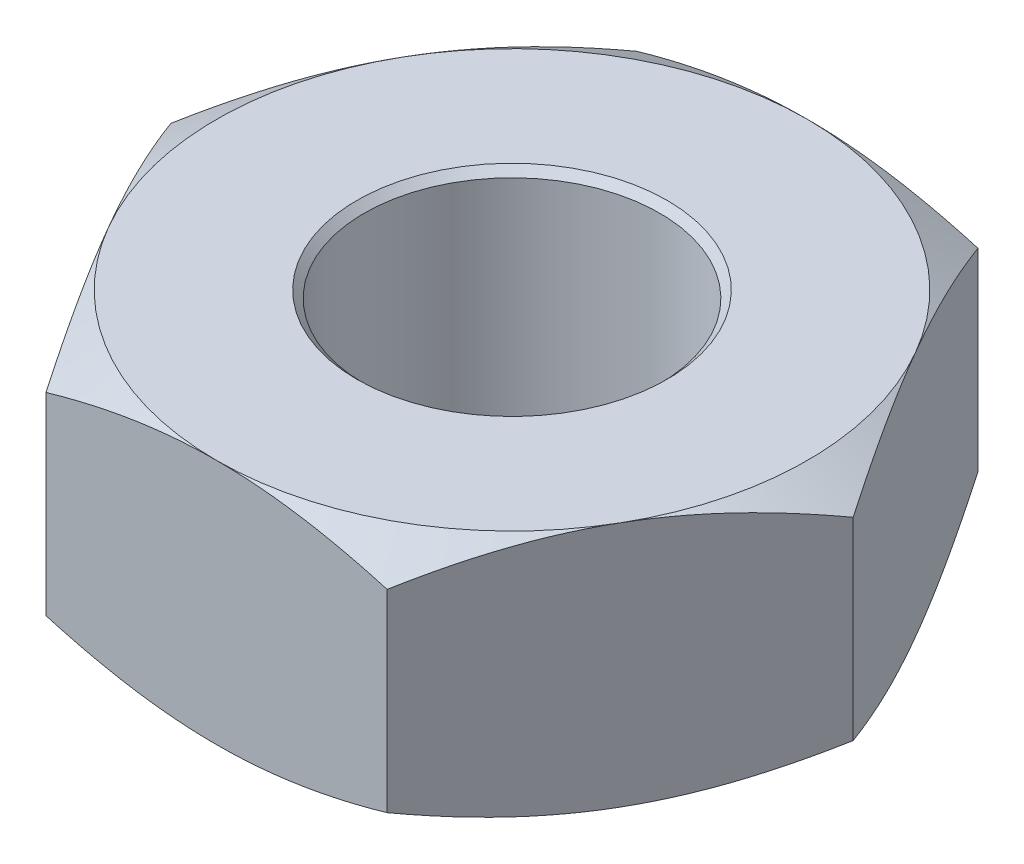
ISO-10303-21;
HEADER;
FILE_DESCRIPTION(('STEP AP214'),'2;1');
FILE_NAME('part.step','',(''),(''),'','','');
FILE_SCHEMA(('AUTOMOTIVE_DESIGN { 1 0 10303 214 1 1 1 1 }'));
ENDSEC;
DATA;
#1=APPLICATION_CONTEXT('core data for automotive mechanical design processes');
#2=APPLICATION_PROTOCOL_DEFINITION('international standard','automotive_design',2000,#1);
#3=PRODUCT_CONTEXT('',#1,'mechanical');
#4=PRODUCT('Part','Part','',(#3));
#5=PRODUCT_RELATED_PRODUCT_CATEGORY('part','',(#4));
#6=PRODUCT_DEFINITION_FORMATION('','',#4);
#7=PRODUCT_DEFINITION_CONTEXT('part definition',#1,'design');
#8=PRODUCT_DEFINITION('design','',#6,#7);
#9=PRODUCT_DEFINITION_SHAPE('','',#8);
#10=(LENGTH_UNIT() NAMED_UNIT(*) SI_UNIT(.MILLI.,.METRE.));
#11=(NAMED_UNIT(*) PLANE_ANGLE_UNIT() SI_UNIT($,.RADIAN.));
#12=(NAMED_UNIT(*) SI_UNIT($,.STERADIAN.) SOLID_ANGLE_UNIT());
#13=UNCERTAINTY_MEASURE_WITH_UNIT(LENGTH_MEASURE(1.E-05),#10,'distance_accuracy_value','');
#14=(GEOMETRIC_REPRESENTATION_CONTEXT(3) GLOBAL_UNCERTAINTY_ASSIGNED_CONTEXT((#13)) GLOBAL_UNIT_ASSIGNED_CONTEXT((#10,
#11,#12)) REPRESENTATION_CONTEXT('',''));
#15=CARTESIAN_POINT('',(0.,0.,0.));
#16=DIRECTION('',(0.,0.,1.));
#17=DIRECTION('',(1.,0.,0.));
#18=AXIS2_PLACEMENT_3D('',#15,#16,#17);
#19=CARTESIAN_POINT('',(0.,2.5,0.));
#20=DIRECTION('',(0.,1.,0.));
#21=DIRECTION('',(0.,0.,1.));
#22=AXIS2_PLACEMENT_3D('',#19,#20,#21);
#23=PLANE('',#22);
#24=CARTESIAN_POINT('',(0.,2.5,0.));
#25=DIRECTION('',(0.,1.,0.));
#26=DIRECTION('',(0.,0.,1.));
#27=AXIS2_PLACEMENT_3D('',#24,#25,#26);
#28=CIRCLE('',#27,1.575);
#29=CARTESIAN_POINT('',(0.,2.5,1.575));
#30=VERTEX_POINT('',#29);
#31=EDGE_CURVE('E12',#30,#30,#28,.F.);
#32=ORIENTED_EDGE('',*,*,#31,.T.);
#33=EDGE_LOOP('',(#32));
#34=FACE_BOUND('',#33,.T.);
#35=CARTESIAN_POINT('',(0.,2.5,0.));
#36=DIRECTION('',(0.,1.,0.));
#37=DIRECTION('',(0.,0.,1.));
#38=AXIS2_PLACEMENT_3D('',#35,#36,#37);
#39=CIRCLE('',#38,3.);
#40=CARTESIAN_POINT('',(-2.59807621135332,2.5,1.5));
#41=VERTEX_POINT('',#40);
#42=CARTESIAN_POINT('',(0.,2.5,3.));
#43=VERTEX_POINT('',#42);
#44=EDGE_CURVE('E158',#41,#43,#39,.T.);
#45=ORIENTED_EDGE('',*,*,#44,.T.);
#46=CARTESIAN_POINT('',(2.59807621135332,2.5,1.5));
#47=VERTEX_POINT('',#46);
#48=EDGE_CURVE('E139',#43,#47,#39,.T.);
#49=ORIENTED_EDGE('',*,*,#48,.T.);
#50=CARTESIAN_POINT('',(2.59807621135332,2.5,-1.5));
#51=VERTEX_POINT('',#50);
#52=EDGE_CURVE('E129',#47,#51,#39,.T.);
#53=ORIENTED_EDGE('',*,*,#52,.T.);
#54=CARTESIAN_POINT('',(0.,2.5,-3.));
#55=VERTEX_POINT('',#54);
#56=EDGE_CURVE('E55',#51,#55,#39,.T.);
#57=ORIENTED_EDGE('',*,*,#56,.T.);
#58=CARTESIAN_POINT('',(-2.59807621135332,2.5,-1.5));
#59=VERTEX_POINT('',#58);
#60=EDGE_CURVE('E63',#55,#59,#39,.T.);
#61=ORIENTED_EDGE('',*,*,#60,.T.);
#62=EDGE_CURVE('E162',#59,#41,#39,.T.);
#63=ORIENTED_EDGE('',*,*,#62,.T.);
#64=EDGE_LOOP('',(#45,#49,#53,#57,#61,#63));
#65=FACE_BOUND('',#64,.T.);
#66=ADVANCED_FACE('F39',(#34,#65),#23,.T.);
#67=CARTESIAN_POINT('',(1.73205080756888,2.5,3.));
#68=DIRECTION('',(-0.866025403784439,0.,-0.5));
#69=DIRECTION('',(-0.5,0.,0.866025403784439));
#70=AXIS2_PLACEMENT_3D('',#67,#68,#69);
#71=PLANE('',#70);
#72=CARTESIAN_POINT('',(1.73193533751504,2.23198413756899,3.0002));
#73=CARTESIAN_POINT('',(1.80805042952748,2.27594629554769,2.86836479341167));
#74=CARTESIAN_POINT('',(1.88482254163057,2.31592841370737,2.73539159464475));
#75=CARTESIAN_POINT('',(2.03969618244675,2.38571791955453,2.46714257999794));
#76=CARTESIAN_POINT('',(2.11780046324563,2.41550061773462,2.33186199736566));
#77=CARTESIAN_POINT('',(2.27304105912604,2.46186216078874,2.06297739790352));
#78=CARTESIAN_POINT('',(2.35015348720802,2.47874955887705,1.92941475457054));
#79=CARTESIAN_POINT('',(2.50474122256553,2.49891035755148,1.66166094270431));
#80=CARTESIAN_POINT('',(2.58221596787771,2.50220045221892,1.52747074752016));
#81=CARTESIAN_POINT('',(2.72698443778646,2.49535946911461,1.27672440230419));
#82=CARTESIAN_POINT('',(2.79429982297457,2.48690808580738,1.16013073502732));
#83=CARTESIAN_POINT('',(2.92849202968483,2.46012105699297,0.927703015025364));
#84=CARTESIAN_POINT('',(2.99536838698943,2.44177625913829,0.811869766348669));
#85=CARTESIAN_POINT('',(3.12983731964848,2.39591524914667,0.578962742943633));
#86=CARTESIAN_POINT('',(3.19741287398332,2.36820461473692,0.46191844948606));
#87=CARTESIAN_POINT('',(3.33155605209904,2.3053122048626,0.229575649500876));
#88=CARTESIAN_POINT('',(3.39812539473502,2.27014520897845,0.114274165828894));
#89=CARTESIAN_POINT('',(3.46421708519159,2.23198413756899,-0.000199999999999475));
#90=B_SPLINE_CURVE_WITH_KNOTS('',3,(#72,#73,#74,#75,#76,#77,#78,#79,#80,#81,#82,#83,#84,#85,#86,
#87,#88,#89),.UNSPECIFIED.,.F.,.F.,(4,2,2,2,2,2,2,2,4),(0.,0.475539830103041,0.952222784107964,
1.41710776961288,1.88142182298026,2.28572436316091,2.69040156475039,3.10405572063576,
3.5168974940707),.UNSPECIFIED.);
#91=CARTESIAN_POINT('',(1.73205080756888,2.23205080756888,3.));
#92=VERTEX_POINT('',#91);
#93=EDGE_CURVE('E144',#92,#47,#90,.T.);
#94=ORIENTED_EDGE('',*,*,#93,.F.);
#95=DIRECTION('',(0.,-1.,0.));
#96=VECTOR('',#95,1.);
#97=CARTESIAN_POINT('',(1.73205080756888,2.5,3.));
#98=LINE('',#97,#96);
#99=CARTESIAN_POINT('',(1.73205080756888,0.267949192431121,3.));
#100=VERTEX_POINT('',#99);
#101=EDGE_CURVE('E355',#92,#100,#98,.T.);
#102=ORIENTED_EDGE('',*,*,#101,.T.);
#103=CARTESIAN_POINT('',(1.73193533751504,0.26801586243101,3.0002));
#104=CARTESIAN_POINT('',(1.80805042952748,0.224053704452306,2.86836479341167));
#105=CARTESIAN_POINT('',(1.88482254163057,0.184071586292628,2.73539159464475));
#106=CARTESIAN_POINT('',(2.03969618244675,0.114282080445466,2.46714257999794));
#107=CARTESIAN_POINT('',(2.11780046324563,0.0844993822653805,2.33186199736566));
#108=CARTESIAN_POINT('',(2.27304105912604,0.0381378392112548,2.06297739790352));
#109=CARTESIAN_POINT('',(2.35015348720802,0.0212504411229496,1.92941475457054));
#110=CARTESIAN_POINT('',(2.50474122256553,0.00108964244852395,1.66166094270431));
#111=CARTESIAN_POINT('',(2.58221596787771,-0.00220045221891933,1.52747074752016));
#112=CARTESIAN_POINT('',(2.72698443778646,0.00464053088539041,1.27672440230419));
#113=CARTESIAN_POINT('',(2.79429982297457,0.0130919141926162,1.16013073502733));
#114=CARTESIAN_POINT('',(2.92849202968483,0.0398789430070345,0.927703015025365));
#115=CARTESIAN_POINT('',(2.99536838698943,0.0582237408617116,0.81186976634867));
#116=CARTESIAN_POINT('',(3.12983731964848,0.104084750853326,0.578962742943633));
#117=CARTESIAN_POINT('',(3.19741287398332,0.131795385263082,0.46191844948606));
#118=CARTESIAN_POINT('',(3.33155605209904,0.1946877951374,0.229575649500876));
#119=CARTESIAN_POINT('',(3.39812539473502,0.229854791021555,0.114274165828894));
#120=CARTESIAN_POINT('',(3.46421708519159,0.268015862431009,-0.000199999999999489));
#121=B_SPLINE_CURVE_WITH_KNOTS('',3,(#103,#104,#105,#106,#107,#108,#109,#110,#111,#112,#113,
#114,#115,#116,#117,#118,#119,#120),.UNSPECIFIED.,.F.,.F.,(4,2,2,2,2,2,2,2,4),(0.,
0.475539830103041,0.952222784107964,1.41710776961288,1.88142182298026,2.28572436316091,
2.69040156475039,3.10405572063576,3.5168974940707),.UNSPECIFIED.);
#122=CARTESIAN_POINT('',(2.59807621135332,0.,1.5));
#123=VERTEX_POINT('',#122);
#124=EDGE_CURVE('E329',#100,#123,#121,.T.);
#125=ORIENTED_EDGE('',*,*,#124,.T.);
#126=CARTESIAN_POINT('',(3.46410161513775,0.26794919243112,0.));
#127=VERTEX_POINT('',#126);
#128=EDGE_CURVE('E354',#123,#127,#121,.T.);
#129=ORIENTED_EDGE('',*,*,#128,.T.);
#130=DIRECTION('',(0.,-1.,0.));
#131=VECTOR('',#130,1.);
#132=CARTESIAN_POINT('',(3.46410161513775,2.5,0.));
#133=LINE('',#132,#131);
#134=CARTESIAN_POINT('',(3.46410161513775,2.23205080756888,0.));
#135=VERTEX_POINT('',#134);
#136=EDGE_CURVE('E155',#135,#127,#133,.T.);
#137=ORIENTED_EDGE('',*,*,#136,.F.);
#138=EDGE_CURVE('E133',#47,#135,#90,.T.);
#139=ORIENTED_EDGE('',*,*,#138,.F.);
#140=EDGE_LOOP('',(#94,#102,#125,#129,#137,#139));
#141=FACE_BOUND('',#140,.T.);
#142=ADVANCED_FACE('F153',(#141),#71,.F.);
#143=CARTESIAN_POINT('',(3.46410161513775,2.5,0.));
#144=DIRECTION('',(-0.866025403784439,0.,0.5));
#145=DIRECTION('',(0.5,0.,0.866025403784439));
#146=AXIS2_PLACEMENT_3D('',#143,#144,#145);
#147=PLANE('',#146);
#148=CARTESIAN_POINT('',(3.46421708519159,2.23198413756899,0.000200000000000041));
#149=CARTESIAN_POINT('',(3.38810199317915,2.2759462955477,-0.131635206588332));
#150=CARTESIAN_POINT('',(3.31132988107606,2.31592841370737,-0.264608405355249));
#151=CARTESIAN_POINT('',(3.15645624025988,2.38571791955454,-0.532857420002055));
#152=CARTESIAN_POINT('',(3.078351959461,2.41550061773462,-0.668138002634341));
#153=CARTESIAN_POINT('',(2.92311136358059,2.46186216078875,-0.937022602096482));
#154=CARTESIAN_POINT('',(2.84599893549861,2.47874955887705,-1.07058524542946));
#155=CARTESIAN_POINT('',(2.6914112001411,2.49891035755148,-1.33833905729569));
#156=CARTESIAN_POINT('',(2.61393645482892,2.50220045221892,-1.47252925247984));
#157=CARTESIAN_POINT('',(2.46916798492017,2.49535946911461,-1.72327559769581));
#158=CARTESIAN_POINT('',(2.40185259973206,2.48690808580738,-1.83986926497268));
#159=CARTESIAN_POINT('',(2.2676603930218,2.46012105699297,-2.07229698497464));
#160=CARTESIAN_POINT('',(2.2007840357172,2.44177625913829,-2.18813023365133));
#161=CARTESIAN_POINT('',(2.06631510305815,2.39591524914667,-2.42103725705637));
#162=CARTESIAN_POINT('',(1.99873954872331,2.36820461473692,-2.53808155051394));
#163=CARTESIAN_POINT('',(1.86459637060759,2.3053122048626,-2.77042435049913));
#164=CARTESIAN_POINT('',(1.79802702797161,2.27014520897844,-2.88572583417111));
#165=CARTESIAN_POINT('',(1.73193533751504,2.23198413756899,-3.0002));
#166=B_SPLINE_CURVE_WITH_KNOTS('',3,(#148,#149,#150,#151,#152,#153,#154,#155,#156,#157,#158,
#159,#160,#161,#162,#163,#164,#165),.UNSPECIFIED.,.F.,.F.,(4,2,2,2,2,2,2,2,4),(0.,
0.47553983010304,0.952222784107963,1.41710776961288,1.88142182298026,2.28572436316091,
2.69040156475039,3.10405572063577,3.51689749407071),.UNSPECIFIED.);
#167=EDGE_CURVE('E135',#135,#51,#166,.T.);
#168=ORIENTED_EDGE('',*,*,#167,.F.);
#169=ORIENTED_EDGE('',*,*,#136,.T.);
#170=CARTESIAN_POINT('',(3.46421708519159,0.268015862431009,0.000200000000000056));
#171=CARTESIAN_POINT('',(3.38810199317915,0.224053704452305,-0.131635206588332));
#172=CARTESIAN_POINT('',(3.31132988107606,0.184071586292627,-0.264608405355249));
#173=CARTESIAN_POINT('',(3.15645624025988,0.114282080445465,-0.532857420002056));
#174=CARTESIAN_POINT('',(3.078351959461,0.0844993822653796,-0.668138002634341));
#175=CARTESIAN_POINT('',(2.92311136358059,0.0381378392112539,-0.937022602096482));
#176=CARTESIAN_POINT('',(2.84599893549861,0.0212504411229489,-1.07058524542946));
#177=CARTESIAN_POINT('',(2.6914112001411,0.00108964244852329,-1.33833905729569));
#178=CARTESIAN_POINT('',(2.61393645482892,-0.00220045221892007,-1.47252925247984));
#179=CARTESIAN_POINT('',(2.46916798492017,0.00464053088538978,-1.72327559769581));
#180=CARTESIAN_POINT('',(2.40185259973206,0.0130919141926157,-1.83986926497268));
#181=CARTESIAN_POINT('',(2.2676603930218,0.0398789430070344,-2.07229698497464));
#182=CARTESIAN_POINT('',(2.2007840357172,0.0582237408617117,-2.18813023365133));
#183=CARTESIAN_POINT('',(2.06631510305815,0.104084750853327,-2.42103725705637));
#184=CARTESIAN_POINT('',(1.99873954872331,0.131795385263082,-2.53808155051394));
#185=CARTESIAN_POINT('',(1.86459637060759,0.1946877951374,-2.77042435049913));
#186=CARTESIAN_POINT('',(1.79802702797161,0.229854791021556,-2.88572583417111));
#187=CARTESIAN_POINT('',(1.73193533751504,0.26801586243101,-3.0002));
#188=B_SPLINE_CURVE_WITH_KNOTS('',3,(#170,#171,#172,#173,#174,#175,#176,#177,#178,#179,#180,
#181,#182,#183,#184,#185,#186,#187),.UNSPECIFIED.,.F.,.F.,(4,2,2,2,2,2,2,2,4),(0.,
0.47553983010304,0.952222784107963,1.41710776961288,1.88142182298026,2.28572436316091,
2.69040156475039,3.10405572063576,3.51689749407071),.UNSPECIFIED.);
#189=CARTESIAN_POINT('',(2.59807621135332,0.,-1.5));
#190=VERTEX_POINT('',#189);
#191=EDGE_CURVE('E353',#127,#190,#188,.T.);
#192=ORIENTED_EDGE('',*,*,#191,.T.);
#193=CARTESIAN_POINT('',(1.73205080756887,0.267949192431122,-3.));
#194=VERTEX_POINT('',#193);
#195=EDGE_CURVE('E276',#190,#194,#188,.T.);
#196=ORIENTED_EDGE('',*,*,#195,.T.);
#197=DIRECTION('',(0.,-1.,0.));
#198=VECTOR('',#197,1.);
#199=CARTESIAN_POINT('',(1.73205080756887,2.5,-3.));
#200=LINE('',#199,#198);
#201=CARTESIAN_POINT('',(1.73205080756887,2.23205080756888,-3.));
#202=VERTEX_POINT('',#201);
#203=EDGE_CURVE('E308',#202,#194,#200,.T.);
#204=ORIENTED_EDGE('',*,*,#203,.F.);
#205=EDGE_CURVE('E294',#51,#202,#166,.T.);
#206=ORIENTED_EDGE('',*,*,#205,.F.);
#207=EDGE_LOOP('',(#168,#169,#192,#196,#204,#206));
#208=FACE_BOUND('',#207,.T.);
#209=ADVANCED_FACE('F286',(#208),#147,.F.);
#210=CARTESIAN_POINT('',(1.73205080756887,2.5,-3.));
#211=DIRECTION('',(0.,0.,1.));
#212=DIRECTION('',(1.,0.,0.));
#213=AXIS2_PLACEMENT_3D('',#210,#211,#212);
#214=PLANE('',#213);
#215=CARTESIAN_POINT('',(6.00425268022764,0.356871231169848,-3.));
#216=CARTESIAN_POINT('',(5.86473041996145,0.428921014392276,-3.));
#217=CARTESIAN_POINT('',(5.72500964617243,0.500589644158594,-3.));
#218=CARTESIAN_POINT('',(5.44507981138725,0.64297240783296,-3.));
#219=CARTESIAN_POINT('',(5.30487074193428,0.713686525105297,-3.));
#220=CARTESIAN_POINT('',(5.02365472206823,0.854076972742319,-3.));
#221=CARTESIAN_POINT('',(4.88264685800049,0.923751476094195,-3.));
#222=CARTESIAN_POINT('',(4.59993610581518,1.0616831036808,-3.));
#223=CARTESIAN_POINT('',(4.45823320800549,1.12994020808031,-3.));
#224=CARTESIAN_POINT('',(4.16639642910305,1.26829469557517,-3.));
#225=CARTESIAN_POINT('',(4.01621664337084,1.33829551887321,-3.));
#226=CARTESIAN_POINT('',(3.71472292322728,1.47580826198024,-3.));
#227=CARTESIAN_POINT('',(3.5634090185299,1.54332024672455,-3.));
#228=CARTESIAN_POINT('',(3.25948309434437,1.67508926942966,-3.));
#229=CARTESIAN_POINT('',(3.10687201002012,1.73934845263113,-3.));
#230=CARTESIAN_POINT('',(2.79990592465827,1.86368244478916,-3.));
#231=CARTESIAN_POINT('',(2.64555053689181,1.92375630379266,-3.));
#232=CARTESIAN_POINT('',(2.3111489722189,2.04707140979012,-3.));
#233=CARTESIAN_POINT('',(2.13076354182027,2.10940649488542,-3.));
#234=CARTESIAN_POINT('',(1.76682724969568,2.22386735942118,-3.));
#235=CARTESIAN_POINT('',(1.58327800374382,2.27599819141495,-3.));
#236=CARTESIAN_POINT('',(1.21625487133985,2.36547916194676,-3.));
#237=CARTESIAN_POINT('',(1.03284880320385,2.40309678723645,-3.));
#238=CARTESIAN_POINT('',(0.755759319548079,2.44662341040051,-3.));
#239=CARTESIAN_POINT('',(0.663075580660516,2.45898171707807,-3.));
#240=CARTESIAN_POINT('',(0.477208637992913,2.47901496031915,-3.));
#241=CARTESIAN_POINT('',(0.384025513971579,2.48669062352622,-3.));
#242=CARTESIAN_POINT('',(0.196018963075258,2.49715957406304,-3.));
#243=CARTESIAN_POINT('',(0.101191437766766,2.49988000370613,-3.));
#244=CARTESIAN_POINT('',(-0.088469765868229,2.50011220972693,-3.));
#245=CARTESIAN_POINT('',(-0.183303444184143,2.49762399484234,-3.));
#246=CARTESIAN_POINT('',(-0.37271334215723,2.48753359170198,-3.));
#247=CARTESIAN_POINT('',(-0.467289512197438,2.47993047947404,-3.));
#248=CARTESIAN_POINT('',(-0.655934324788337,2.45989192879627,-3.));
#249=CARTESIAN_POINT('',(-0.750002881021765,2.4474556932161,-3.));
#250=CARTESIAN_POINT('',(-1.03496705665352,2.40290558606778,-3.));
#251=CARTESIAN_POINT('',(-1.22478167068484,2.3637802985462,-3.));
#252=CARTESIAN_POINT('',(-1.6008338919411,2.27130476763005,-3.));
#253=CARTESIAN_POINT('',(-1.7870702081686,2.21794948986926,-3.));
#254=CARTESIAN_POINT('',(-2.15252929913434,2.10206259482558,-3.));
#255=CARTESIAN_POINT('',(-2.33181787995182,2.03973505014779,-3.));
#256=CARTESIAN_POINT('',(-2.68774534775123,1.90787770041704,-3.));
#257=CARTESIAN_POINT('',(-2.86438351147797,1.83834596895604,-3.));
#258=CARTESIAN_POINT('',(-3.2157039562033,1.69397220819073,-3.));
#259=CARTESIAN_POINT('',(-3.39038366252905,1.61912396451583,-3.));
#260=CARTESIAN_POINT('',(-3.73800798148471,1.46557348822255,-3.));
#261=CARTESIAN_POINT('',(-3.91095278367861,1.38687168231319,-3.));
#262=CARTESIAN_POINT('',(-4.24543269058928,1.23124593501539,-3.));
#263=CARTESIAN_POINT('',(-4.40704457514254,1.15448633708797,-3.));
#264=CARTESIAN_POINT('',(-4.72930700142372,0.998965017562986,-3.));
#265=CARTESIAN_POINT('',(-4.88995750903086,0.920203225418956,-3.));
#266=CARTESIAN_POINT('',(-5.20991667104059,0.761385126458692,-3.));
#267=CARTESIAN_POINT('',(-5.36922805216593,0.681334300127657,-3.));
#268=CARTESIAN_POINT('',(-5.68719491577223,0.519974261265355,-3.));
#269=CARTESIAN_POINT('',(-5.84585045533065,0.438665161292307,-3.));
#270=CARTESIAN_POINT('',(-6.00425268022764,0.356871231169845,-3.));
#271=B_SPLINE_CURVE_WITH_KNOTS('',3,(#215,#216,#217,#218,#219,#220,#221,#222,#223,#224,#225,
#226,#227,#228,#229,#230,#231,#232,#233,#234,#235,#236,#237,#238,#239,#240,#241,#242,#243,#244,
#245,#246,#247,#248,#249,#250,#251,#252,#253,#254,#255,#256,#257,#258,#259,#260,#261,#262,#263,
#264,#265,#266,#267,#268,#269,#270),.UNSPECIFIED.,.F.,.F.,(4,2,2,2,2,2,2,2,2,2,2,2,2,2,2,2,2,2,
2,2,2,2,2,2,2,2,2,4),(0.,0.471084110202455,0.942176420115815,1.41401707997586,1.88586433837422,
2.38292480970965,2.87997230324004,3.37668760229776,3.87351527718165,4.44584951561338,
5.01789964653016,5.5788358047474,5.85924709756718,6.1396148656289,6.42407264590739,
6.70852994899798,6.9930386512107,7.27759429756611,7.85819315526503,8.43899769360837,
9.00822704514367,9.57760900405088,10.1476678169992,10.7176636488592,11.2543906793309,
11.7911366474365,12.3260084110505,12.8608326014377),.UNSPECIFIED.);
#272=EDGE_CURVE('E299',#202,#55,#271,.T.);
#273=ORIENTED_EDGE('',*,*,#272,.F.);
#274=ORIENTED_EDGE('',*,*,#203,.T.);
#275=CARTESIAN_POINT('',(6.00425268022764,2.14312876883015,-3.));
#276=CARTESIAN_POINT('',(5.86473041996145,2.07107898560772,-3.));
#277=CARTESIAN_POINT('',(5.72500964617243,1.99941035584141,-3.));
#278=CARTESIAN_POINT('',(5.44507981138725,1.85702759216704,-3.));
#279=CARTESIAN_POINT('',(5.30487074193428,1.7863134748947,-3.));
#280=CARTESIAN_POINT('',(5.02365472206823,1.64592302725768,-3.));
#281=CARTESIAN_POINT('',(4.88264685800049,1.57624852390581,-3.));
#282=CARTESIAN_POINT('',(4.59993610581518,1.4383168963192,-3.));
#283=CARTESIAN_POINT('',(4.45823320800549,1.37005979191969,-3.));
#284=CARTESIAN_POINT('',(4.16639642910305,1.23170530442483,-3.));
#285=CARTESIAN_POINT('',(4.01621664337084,1.16170448112679,-3.));
#286=CARTESIAN_POINT('',(3.71472292322728,1.02419173801976,-3.));
#287=CARTESIAN_POINT('',(3.5634090185299,0.956679753275449,-3.));
#288=CARTESIAN_POINT('',(3.25948309434437,0.824910730570338,-3.));
#289=CARTESIAN_POINT('',(3.10687201002012,0.760651547368871,-3.));
#290=CARTESIAN_POINT('',(2.79990592465827,0.636317555210841,-3.));
#291=CARTESIAN_POINT('',(2.64555053689181,0.576243696207336,-3.));
#292=CARTESIAN_POINT('',(2.3111489722189,0.452928590209882,-3.));
#293=CARTESIAN_POINT('',(2.13076354182027,0.390593505114583,-3.));
#294=CARTESIAN_POINT('',(1.76682724969569,0.276132640578825,-3.));
#295=CARTESIAN_POINT('',(1.58327800374382,0.224001808585046,-3.));
#296=CARTESIAN_POINT('',(1.21625487133986,0.134520838053239,-3.));
#297=CARTESIAN_POINT('',(1.03284880320385,0.0969032127635509,-3.));
#298=CARTESIAN_POINT('',(0.75575931954808,0.0533765895994892,-3.));
#299=CARTESIAN_POINT('',(0.663075580660518,0.0410182829219286,-3.));
#300=CARTESIAN_POINT('',(0.477208637992914,0.0209850396808547,-3.));
#301=CARTESIAN_POINT('',(0.38402551397158,0.0133093764737789,-3.));
#302=CARTESIAN_POINT('',(0.196018963075259,0.00284042593696308,-3.));
#303=CARTESIAN_POINT('',(0.101191437766767,0.000119996293873615,-3.));
#304=CARTESIAN_POINT('',(-0.0884697658682277,-0.000112209726933698,-3.));
#305=CARTESIAN_POINT('',(-0.183303444184142,0.00237600515765748,-3.));
#306=CARTESIAN_POINT('',(-0.372713342157229,0.0124664082980158,-3.));
#307=CARTESIAN_POINT('',(-0.467289512197438,0.0200695205259573,-3.));
#308=CARTESIAN_POINT('',(-0.655934324788338,0.0401080712037259,-3.));
#309=CARTESIAN_POINT('',(-0.750002881021765,0.0525443067838957,-3.));
#310=CARTESIAN_POINT('',(-1.03496705665352,0.0970944139322183,-3.));
#311=CARTESIAN_POINT('',(-1.22478167068484,0.136219701453802,-3.));
#312=CARTESIAN_POINT('',(-1.6008338919411,0.228695232369948,-3.));
#313=CARTESIAN_POINT('',(-1.7870702081686,0.282050510130739,-3.));
#314=CARTESIAN_POINT('',(-2.15252929913435,0.397937405174417,-3.));
#315=CARTESIAN_POINT('',(-2.33181787995182,0.460264949852214,-3.));
#316=CARTESIAN_POINT('',(-2.68774534775123,0.592122299582961,-3.));
#317=CARTESIAN_POINT('',(-2.86438351147797,0.661654031043964,-3.));
#318=CARTESIAN_POINT('',(-3.2157039562033,0.806027791809266,-3.));
#319=CARTESIAN_POINT('',(-3.39038366252905,0.880876035484172,-3.));
#320=CARTESIAN_POINT('',(-3.73800798148471,1.03442651177745,-3.));
#321=CARTESIAN_POINT('',(-3.91095278367861,1.11312831768681,-3.));
#322=CARTESIAN_POINT('',(-4.24543269058928,1.26875406498461,-3.));
#323=CARTESIAN_POINT('',(-4.40704457514254,1.34551366291203,-3.));
#324=CARTESIAN_POINT('',(-4.72930700142372,1.50103498243701,-3.));
#325=CARTESIAN_POINT('',(-4.88995750903087,1.57979677458104,-3.));
#326=CARTESIAN_POINT('',(-5.20991667104059,1.73861487354131,-3.));
#327=CARTESIAN_POINT('',(-5.36922805216593,1.81866569987235,-3.));
#328=CARTESIAN_POINT('',(-5.68719491577224,1.98002573873465,-3.));
#329=CARTESIAN_POINT('',(-5.84585045533065,2.06133483870769,-3.));
#330=CARTESIAN_POINT('',(-6.00425268022764,2.14312876883016,-3.));
#331=B_SPLINE_CURVE_WITH_KNOTS('',3,(#275,#276,#277,#278,#279,#280,#281,#282,#283,#284,#285,
#286,#287,#288,#289,#290,#291,#292,#293,#294,#295,#296,#297,#298,#299,#300,#301,#302,#303,#304,
#305,#306,#307,#308,#309,#310,#311,#312,#313,#314,#315,#316,#317,#318,#319,#320,#321,#322,#323,
#324,#325,#326,#327,#328,#329,#330),.UNSPECIFIED.,.F.,.F.,(4,2,2,2,2,2,2,2,2,2,2,2,2,2,2,2,2,2,
2,2,2,2,2,2,2,2,2,4),(0.,0.471084110202456,0.942176420115816,1.41401707997587,1.88586433837422,
2.38292480970964,2.87997230324004,3.37668760229776,3.87351527718165,4.44584951561338,
5.01789964653016,5.57883580474741,5.85924709756718,6.1396148656289,6.42407264590739,
6.70852994899798,6.9930386512107,7.27759429756611,7.85819315526503,8.43899769360838,
9.00822704514367,9.57760900405088,10.1476678169992,10.7176636488592,11.2543906793309,
11.7911366474365,12.3260084110505,12.8608326014377),.UNSPECIFIED.);
#332=CARTESIAN_POINT('',(0.,0.,-3.));
#333=VERTEX_POINT('',#332);
#334=EDGE_CURVE('E275',#194,#333,#331,.T.);
#335=ORIENTED_EDGE('',*,*,#334,.T.);
#336=CARTESIAN_POINT('',(-1.73205080756888,0.267949192431123,-3.));
#337=VERTEX_POINT('',#336);
#338=EDGE_CURVE('E268',#333,#337,#331,.T.);
#339=ORIENTED_EDGE('',*,*,#338,.T.);
#340=DIRECTION('',(0.,-1.,0.));
#341=VECTOR('',#340,1.);
#342=CARTESIAN_POINT('',(-1.73205080756888,2.5,-3.));
#343=LINE('',#342,#341);
#344=CARTESIAN_POINT('',(-1.73205080756888,2.23205080756888,-3.));
#345=VERTEX_POINT('',#344);
#346=EDGE_CURVE('E303',#345,#337,#343,.T.);
#347=ORIENTED_EDGE('',*,*,#346,.F.);
#348=EDGE_CURVE('E174',#55,#345,#271,.T.);
#349=ORIENTED_EDGE('',*,*,#348,.F.);
#350=EDGE_LOOP('',(#273,#274,#335,#339,#347,#349));
#351=FACE_BOUND('',#350,.T.);
#352=ADVANCED_FACE('F283',(#351),#214,.F.);
#353=CARTESIAN_POINT('',(-1.73205080756888,2.5,-3.));
#354=DIRECTION('',(0.866025403784439,0.,0.5));
#355=DIRECTION('',(0.5,0.,-0.866025403784439));
#356=AXIS2_PLACEMENT_3D('',#353,#354,#355);
#357=PLANE('',#356);
#358=CARTESIAN_POINT('',(-1.73193533751504,2.23198413756899,-3.0002));
#359=CARTESIAN_POINT('',(-1.80805042952748,2.27594629554769,-2.86836479341167));
#360=CARTESIAN_POINT('',(-1.88482254163057,2.31592841370737,-2.73539159464475));
#361=CARTESIAN_POINT('',(-2.03969618244675,2.38571791955453,-2.46714257999795));
#362=CARTESIAN_POINT('',(-2.11780046324563,2.41550061773462,-2.33186199736566));
#363=CARTESIAN_POINT('',(-2.27304105912605,2.46186216078874,-2.06297739790352));
#364=CARTESIAN_POINT('',(-2.35015348720802,2.47874955887705,-1.92941475457054));
#365=CARTESIAN_POINT('',(-2.50474122256554,2.49891035755147,-1.66166094270431));
#366=CARTESIAN_POINT('',(-2.58221596787771,2.50220045221892,-1.52747074752016));
#367=CARTESIAN_POINT('',(-2.72698443778647,2.49535946911461,-1.2767244023042));
#368=CARTESIAN_POINT('',(-2.79429982297457,2.48690808580738,-1.16013073502733));
#369=CARTESIAN_POINT('',(-2.92849202968483,2.46012105699296,-0.927703015025365));
#370=CARTESIAN_POINT('',(-2.99536838698943,2.44177625913829,-0.81186976634867));
#371=CARTESIAN_POINT('',(-3.12983731964849,2.39591524914667,-0.578962742943633));
#372=CARTESIAN_POINT('',(-3.19741287398333,2.36820461473692,-0.46191844948606));
#373=CARTESIAN_POINT('',(-3.33155605209904,2.3053122048626,-0.229575649500876));
#374=CARTESIAN_POINT('',(-3.39812539473502,2.27014520897844,-0.114274165828894));
#375=CARTESIAN_POINT('',(-3.4642170851916,2.23198413756899,0.000199999999999558));
#376=B_SPLINE_CURVE_WITH_KNOTS('',3,(#358,#359,#360,#361,#362,#363,#364,#365,#366,#367,#368,
#369,#370,#371,#372,#373,#374,#375),.UNSPECIFIED.,.F.,.F.,(4,2,2,2,2,2,2,2,4),(0.,
0.475539830103041,0.952222784107965,1.41710776961288,1.88142182298026,2.28572436316091,
2.69040156475039,3.10405572063577,3.51689749407071),.UNSPECIFIED.);
#377=EDGE_CURVE('E171',#345,#59,#376,.T.);
#378=ORIENTED_EDGE('',*,*,#377,.F.);
#379=ORIENTED_EDGE('',*,*,#346,.T.);
#380=CARTESIAN_POINT('',(-1.73193533751504,0.268015862431012,-3.0002));
#381=CARTESIAN_POINT('',(-1.80805042952748,0.224053704452308,-2.86836479341167));
#382=CARTESIAN_POINT('',(-1.88482254163057,0.18407158629263,-2.73539159464475));
#383=CARTESIAN_POINT('',(-2.03969618244675,0.114282080445467,-2.46714257999795));
#384=CARTESIAN_POINT('',(-2.11780046324563,0.0844993822653819,-2.33186199736566));
#385=CARTESIAN_POINT('',(-2.27304105912605,0.0381378392112561,-2.06297739790352));
#386=CARTESIAN_POINT('',(-2.35015348720802,0.021250441122951,-1.92941475457054));
#387=CARTESIAN_POINT('',(-2.50474122256554,0.00108964244852542,-1.66166094270431));
#388=CARTESIAN_POINT('',(-2.58221596787771,-0.0022004522189179,-1.52747074752016));
#389=CARTESIAN_POINT('',(-2.72698443778647,0.00464053088539187,-1.2767244023042));
#390=CARTESIAN_POINT('',(-2.79429982297457,0.0130919141926177,-1.16013073502733));
#391=CARTESIAN_POINT('',(-2.92849202968484,0.0398789430070362,-0.927703015025365));
#392=CARTESIAN_POINT('',(-2.99536838698943,0.0582237408617133,-0.81186976634867));
#393=CARTESIAN_POINT('',(-3.12983731964849,0.104084750853328,-0.578962742943633));
#394=CARTESIAN_POINT('',(-3.19741287398333,0.131795385263083,-0.46191844948606));
#395=CARTESIAN_POINT('',(-3.33155605209904,0.194687795137401,-0.229575649500876));
#396=CARTESIAN_POINT('',(-3.39812539473502,0.229854791021557,-0.114274165828894));
#397=CARTESIAN_POINT('',(-3.4642170851916,0.268015862431011,0.000199999999999554));
#398=B_SPLINE_CURVE_WITH_KNOTS('',3,(#380,#381,#382,#383,#384,#385,#386,#387,#388,#389,#390,
#391,#392,#393,#394,#395,#396,#397),.UNSPECIFIED.,.F.,.F.,(4,2,2,2,2,2,2,2,4),(0.,
0.47553983010304,0.952222784107965,1.41710776961288,1.88142182298026,2.28572436316091,
2.69040156475039,3.10405572063577,3.51689749407071),.UNSPECIFIED.);
#399=CARTESIAN_POINT('',(-2.59807621135332,0.,-1.5));
#400=VERTEX_POINT('',#399);
#401=EDGE_CURVE('E267',#337,#400,#398,.T.);
#402=ORIENTED_EDGE('',*,*,#401,.T.);
#403=CARTESIAN_POINT('',(-3.46410161513776,0.267949192431122,0.));
#404=VERTEX_POINT('',#403);
#405=EDGE_CURVE('E261',#400,#404,#398,.T.);
#406=ORIENTED_EDGE('',*,*,#405,.T.);
#407=DIRECTION('',(0.,-1.,0.));
#408=VECTOR('',#407,1.);
#409=CARTESIAN_POINT('',(-3.46410161513776,2.5,0.));
#410=LINE('',#409,#408);
#411=CARTESIAN_POINT('',(-3.46410161513776,2.23205080756888,0.));
#412=VERTEX_POINT('',#411);
#413=EDGE_CURVE('E181',#412,#404,#410,.T.);
#414=ORIENTED_EDGE('',*,*,#413,.F.);
#415=EDGE_CURVE('E167',#59,#412,#376,.T.);
#416=ORIENTED_EDGE('',*,*,#415,.F.);
#417=EDGE_LOOP('',(#378,#379,#402,#406,#414,#416));
#418=FACE_BOUND('',#417,.T.);
#419=ADVANCED_FACE('F179',(#418),#357,.F.);
#420=CARTESIAN_POINT('',(-3.46410161513776,2.5,0.));
#421=DIRECTION('',(0.866025403784439,0.,-0.5));
#422=DIRECTION('',(-0.5,0.,-0.866025403784439));
#423=AXIS2_PLACEMENT_3D('',#420,#421,#422);
#424=PLANE('',#423);
#425=CARTESIAN_POINT('',(-3.46421708519159,2.23198413756899,-0.000200000000000921));
#426=CARTESIAN_POINT('',(-3.38810199317915,2.27594629554769,0.131635206588331));
#427=CARTESIAN_POINT('',(-3.31132988107607,2.31592841370737,0.264608405355248));
#428=CARTESIAN_POINT('',(-3.15645624025988,2.38571791955453,0.532857420002055));
#429=CARTESIAN_POINT('',(-3.078351959461,2.41550061773462,0.668138002634341));
#430=CARTESIAN_POINT('',(-2.92311136358059,2.46186216078874,0.937022602096482));
#431=CARTESIAN_POINT('',(-2.84599893549862,2.47874955887705,1.07058524542946));
#432=CARTESIAN_POINT('',(-2.6914112001411,2.49891035755148,1.33833905729569));
#433=CARTESIAN_POINT('',(-2.61393645482892,2.50220045221892,1.47252925247984));
#434=CARTESIAN_POINT('',(-2.46916798492017,2.49535946911461,1.72327559769581));
#435=CARTESIAN_POINT('',(-2.40185259973206,2.48690808580738,1.83986926497268));
#436=CARTESIAN_POINT('',(-2.2676603930218,2.46012105699296,2.07229698497464));
#437=CARTESIAN_POINT('',(-2.2007840357172,2.44177625913829,2.18813023365133));
#438=CARTESIAN_POINT('',(-2.06631510305815,2.39591524914667,2.42103725705637));
#439=CARTESIAN_POINT('',(-1.99873954872331,2.36820461473692,2.53808155051394));
#440=CARTESIAN_POINT('',(-1.86459637060759,2.3053122048626,2.77042435049913));
#441=CARTESIAN_POINT('',(-1.79802702797161,2.27014520897844,2.88572583417111));
#442=CARTESIAN_POINT('',(-1.73193533751504,2.23198413756899,3.0002));
#443=B_SPLINE_CURVE_WITH_KNOTS('',3,(#425,#426,#427,#428,#429,#430,#431,#432,#433,#434,#435,
#436,#437,#438,#439,#440,#441,#442),.UNSPECIFIED.,.F.,.F.,(4,2,2,2,2,2,2,2,4),(0.,
0.475539830103041,0.952222784107964,1.41710776961288,1.88142182298026,2.28572436316091,
2.69040156475039,3.10405572063576,3.5168974940707),.UNSPECIFIED.);
#444=EDGE_CURVE('E160',#412,#41,#443,.T.);
#445=ORIENTED_EDGE('',*,*,#444,.F.);
#446=ORIENTED_EDGE('',*,*,#413,.T.);
#447=CARTESIAN_POINT('',(-3.46421708519159,0.268015862431011,-0.000200000000000892));
#448=CARTESIAN_POINT('',(-3.38810199317915,0.224053704452307,0.131635206588331));
#449=CARTESIAN_POINT('',(-3.31132988107607,0.184071586292629,0.264608405355248));
#450=CARTESIAN_POINT('',(-3.15645624025988,0.114282080445467,0.532857420002055));
#451=CARTESIAN_POINT('',(-3.078351959461,0.0844993822653815,0.668138002634341));
#452=CARTESIAN_POINT('',(-2.92311136358059,0.0381378392112558,0.937022602096482));
#453=CARTESIAN_POINT('',(-2.84599893549862,0.0212504411229507,1.07058524542946));
#454=CARTESIAN_POINT('',(-2.6914112001411,0.00108964244852508,1.33833905729569));
#455=CARTESIAN_POINT('',(-2.61393645482892,-0.00220045221891824,1.47252925247984));
#456=CARTESIAN_POINT('',(-2.46916798492017,0.00464053088539157,1.72327559769581));
#457=CARTESIAN_POINT('',(-2.40185259973206,0.0130919141926174,1.83986926497268));
#458=CARTESIAN_POINT('',(-2.2676603930218,0.039878943007036,2.07229698497464));
#459=CARTESIAN_POINT('',(-2.2007840357172,0.0582237408617132,2.18813023365133));
#460=CARTESIAN_POINT('',(-2.06631510305815,0.104084750853328,2.42103725705637));
#461=CARTESIAN_POINT('',(-1.99873954872331,0.131795385263083,2.53808155051394));
#462=CARTESIAN_POINT('',(-1.86459637060759,0.194687795137401,2.77042435049913));
#463=CARTESIAN_POINT('',(-1.79802702797161,0.229854791021556,2.88572583417111));
#464=CARTESIAN_POINT('',(-1.73193533751504,0.26801586243101,3.0002));
#465=B_SPLINE_CURVE_WITH_KNOTS('',3,(#447,#448,#449,#450,#451,#452,#453,#454,#455,#456,#457,
#458,#459,#460,#461,#462,#463,#464),.UNSPECIFIED.,.F.,.F.,(4,2,2,2,2,2,2,2,4),(0.,
0.475539830103041,0.952222784107964,1.41710776961288,1.88142182298026,2.28572436316091,
2.69040156475039,3.10405572063576,3.5168974940707),.UNSPECIFIED.);
#466=CARTESIAN_POINT('',(-2.59807621135332,0.,1.5));
#467=VERTEX_POINT('',#466);
#468=EDGE_CURVE('E259',#404,#467,#465,.T.);
#469=ORIENTED_EDGE('',*,*,#468,.T.);
#470=CARTESIAN_POINT('',(-1.73205080756888,0.267949192431122,3.));
#471=VERTEX_POINT('',#470);
#472=EDGE_CURVE('E252',#467,#471,#465,.T.);
#473=ORIENTED_EDGE('',*,*,#472,.T.);
#474=DIRECTION('',(0.,-1.,0.));
#475=VECTOR('',#474,1.);
#476=CARTESIAN_POINT('',(-1.73205080756888,2.5,3.));
#477=LINE('',#476,#475);
#478=CARTESIAN_POINT('',(-1.73205080756888,2.23205080756888,3.));
#479=VERTEX_POINT('',#478);
#480=EDGE_CURVE('E311',#479,#471,#477,.T.);
#481=ORIENTED_EDGE('',*,*,#480,.F.);
#482=EDGE_CURVE('E159',#41,#479,#443,.T.);
#483=ORIENTED_EDGE('',*,*,#482,.F.);
#484=EDGE_LOOP('',(#445,#446,#469,#473,#481,#483));
#485=FACE_BOUND('',#484,.T.);
#486=ADVANCED_FACE('F243',(#485),#424,.F.);
#487=CARTESIAN_POINT('',(-1.73205080756888,2.5,3.));
#488=DIRECTION('',(0.,0.,-1.));
#489=DIRECTION('',(-1.,0.,0.));
#490=AXIS2_PLACEMENT_3D('',#487,#488,#489);
#491=PLANE('',#490);
#492=CARTESIAN_POINT('',(-6.00425268022765,0.356871231169843,3.));
#493=CARTESIAN_POINT('',(-5.86473041996146,0.428921014392272,3.));
#494=CARTESIAN_POINT('',(-5.72500964617244,0.50058964415859,3.));
#495=CARTESIAN_POINT('',(-5.44507981138726,0.642972407832956,3.));
#496=CARTESIAN_POINT('',(-5.30487074193429,0.713686525105293,3.));
#497=CARTESIAN_POINT('',(-5.02365472206824,0.854076972742315,3.));
#498=CARTESIAN_POINT('',(-4.8826468580005,0.923751476094192,3.));
#499=CARTESIAN_POINT('',(-4.59993610581519,1.06168310368079,3.));
#500=CARTESIAN_POINT('',(-4.4582332080055,1.1299402080803,3.));
#501=CARTESIAN_POINT('',(-4.16639642910306,1.26829469557517,3.));
#502=CARTESIAN_POINT('',(-4.01621664337085,1.33829551887321,3.));
#503=CARTESIAN_POINT('',(-3.71472292322728,1.47580826198023,3.));
#504=CARTESIAN_POINT('',(-3.56340901852991,1.54332024672455,3.));
#505=CARTESIAN_POINT('',(-3.25948309434438,1.67508926942966,3.));
#506=CARTESIAN_POINT('',(-3.10687201002012,1.73934845263113,3.));
#507=CARTESIAN_POINT('',(-2.79990592465828,1.86368244478916,3.));
#508=CARTESIAN_POINT('',(-2.64555053689182,1.92375630379266,3.));
#509=CARTESIAN_POINT('',(-2.31114897221891,2.04707140979012,3.));
#510=CARTESIAN_POINT('',(-2.13076354182028,2.10940649488542,3.));
#511=CARTESIAN_POINT('',(-1.76682724969569,2.22386735942118,3.));
#512=CARTESIAN_POINT('',(-1.58327800374382,2.27599819141495,3.));
#513=CARTESIAN_POINT('',(-1.21625487133986,2.36547916194676,3.));
#514=CARTESIAN_POINT('',(-1.03284880320386,2.40309678723645,3.));
#515=CARTESIAN_POINT('',(-0.755759319548087,2.44662341040051,3.));
#516=CARTESIAN_POINT('',(-0.663075580660524,2.45898171707807,3.));
#517=CARTESIAN_POINT('',(-0.477208637992921,2.47901496031915,3.));
#518=CARTESIAN_POINT('',(-0.384025513971587,2.48669062352622,3.));
#519=CARTESIAN_POINT('',(-0.196018963075265,2.49715957406304,3.));
#520=CARTESIAN_POINT('',(-0.101191437766774,2.49988000370613,3.));
#521=CARTESIAN_POINT('',(0.0884697658682213,2.50011220972694,3.));
#522=CARTESIAN_POINT('',(0.183303444184136,2.49762399484234,3.));
#523=CARTESIAN_POINT('',(0.372713342157222,2.48753359170199,3.));
#524=CARTESIAN_POINT('',(0.46728951219743,2.47993047947404,3.));
#525=CARTESIAN_POINT('',(0.65593432478833,2.45989192879628,3.));
#526=CARTESIAN_POINT('',(0.750002881021757,2.44745569321611,3.));
#527=CARTESIAN_POINT('',(1.03496705665351,2.40290558606778,3.));
#528=CARTESIAN_POINT('',(1.22478167068483,2.3637802985462,3.));
#529=CARTESIAN_POINT('',(1.60083389194109,2.27130476763006,3.));
#530=CARTESIAN_POINT('',(1.78707020816859,2.21794948986927,3.));
#531=CARTESIAN_POINT('',(2.15252929913434,2.10206259482559,3.));
#532=CARTESIAN_POINT('',(2.33181787995181,2.03973505014779,3.));
#533=CARTESIAN_POINT('',(2.68774534775123,1.90787770041704,3.));
#534=CARTESIAN_POINT('',(2.86438351147797,1.83834596895604,3.));
#535=CARTESIAN_POINT('',(3.2157039562033,1.69397220819074,3.));
#536=CARTESIAN_POINT('',(3.39038366252905,1.61912396451583,3.));
#537=CARTESIAN_POINT('',(3.73800798148471,1.46557348822255,3.));
#538=CARTESIAN_POINT('',(3.91095278367861,1.38687168231319,3.));
#539=CARTESIAN_POINT('',(4.24543269058928,1.23124593501539,3.));
#540=CARTESIAN_POINT('',(4.40704457514254,1.15448633708797,3.));
#541=CARTESIAN_POINT('',(4.72930700142372,0.998965017562985,3.));
#542=CARTESIAN_POINT('',(4.88995750903087,0.920203225418956,3.));
#543=CARTESIAN_POINT('',(5.20991667104059,0.761385126458692,3.));
#544=CARTESIAN_POINT('',(5.36922805216593,0.681334300127655,3.));
#545=CARTESIAN_POINT('',(5.68719491577224,0.519974261265353,3.));
#546=CARTESIAN_POINT('',(5.84585045533065,0.438665161292305,3.));
#547=CARTESIAN_POINT('',(6.00425268022764,0.356871231169844,3.));
#548=B_SPLINE_CURVE_WITH_KNOTS('',3,(#492,#493,#494,#495,#496,#497,#498,#499,#500,#501,#502,
#503,#504,#505,#506,#507,#508,#509,#510,#511,#512,#513,#514,#515,#516,#517,#518,#519,#520,#521,
#522,#523,#524,#525,#526,#527,#528,#529,#530,#531,#532,#533,#534,#535,#536,#537,#538,#539,#540,
#541,#542,#543,#544,#545,#546,#547),.UNSPECIFIED.,.F.,.F.,(4,2,2,2,2,2,2,2,2,2,2,2,2,2,2,2,2,2,
2,2,2,2,2,2,2,2,2,4),(0.,0.471084110202456,0.942176420115817,1.41401707997587,1.88586433837422,
2.38292480970965,2.87997230324005,3.37668760229777,3.87351527718165,4.44584951561338,
5.01789964653017,5.57883580474741,5.85924709756719,6.1396148656289,6.4240726459074,
6.70852994899798,6.99303865121071,7.27759429756612,7.85819315526503,8.43899769360838,
9.00822704514367,9.57760900405089,10.1476678169992,10.7176636488592,11.2543906793309,
11.7911366474365,12.3260084110505,12.8608326014377),.UNSPECIFIED.);
#549=EDGE_CURVE('E228',#479,#43,#548,.T.);
#550=ORIENTED_EDGE('',*,*,#549,.F.);
#551=ORIENTED_EDGE('',*,*,#480,.T.);
#552=CARTESIAN_POINT('',(-6.00425268022765,2.14312876883016,3.));
#553=CARTESIAN_POINT('',(-5.86473041996146,2.07107898560773,3.));
#554=CARTESIAN_POINT('',(-5.72500964617244,1.99941035584141,3.));
#555=CARTESIAN_POINT('',(-5.44507981138726,1.85702759216704,3.));
#556=CARTESIAN_POINT('',(-5.30487074193429,1.78631347489471,3.));
#557=CARTESIAN_POINT('',(-5.02365472206824,1.64592302725769,3.));
#558=CARTESIAN_POINT('',(-4.8826468580005,1.57624852390581,3.));
#559=CARTESIAN_POINT('',(-4.59993610581519,1.43831689631921,3.));
#560=CARTESIAN_POINT('',(-4.4582332080055,1.3700597919197,3.));
#561=CARTESIAN_POINT('',(-4.16639642910306,1.23170530442483,3.));
#562=CARTESIAN_POINT('',(-4.01621664337085,1.16170448112679,3.));
#563=CARTESIAN_POINT('',(-3.71472292322728,1.02419173801977,3.));
#564=CARTESIAN_POINT('',(-3.56340901852991,0.95667975327545,3.));
#565=CARTESIAN_POINT('',(-3.25948309434438,0.824910730570338,3.));
#566=CARTESIAN_POINT('',(-3.10687201002012,0.760651547368871,3.));
#567=CARTESIAN_POINT('',(-2.79990592465828,0.636317555210841,3.));
#568=CARTESIAN_POINT('',(-2.64555053689182,0.576243696207337,3.));
#569=CARTESIAN_POINT('',(-2.31114897221891,0.452928590209883,3.));
#570=CARTESIAN_POINT('',(-2.13076354182028,0.390593505114583,3.));
#571=CARTESIAN_POINT('',(-1.76682724969569,0.276132640578825,3.));
#572=CARTESIAN_POINT('',(-1.58327800374382,0.224001808585046,3.));
#573=CARTESIAN_POINT('',(-1.21625487133986,0.134520838053239,3.));
#574=CARTESIAN_POINT('',(-1.03284880320386,0.0969032127635499,3.));
#575=CARTESIAN_POINT('',(-0.755759319548085,0.0533765895994883,3.));
#576=CARTESIAN_POINT('',(-0.663075580660523,0.0410182829219278,3.));
#577=CARTESIAN_POINT('',(-0.47720863799292,0.0209850396808538,3.));
#578=CARTESIAN_POINT('',(-0.384025513971586,0.0133093764737777,3.));
#579=CARTESIAN_POINT('',(-0.196018963075265,0.00284042593696153,3.));
#580=CARTESIAN_POINT('',(-0.101191437766773,0.000119996293872089,3.));
#581=CARTESIAN_POINT('',(0.0884697658682212,-0.000112209726935428,3.));
#582=CARTESIAN_POINT('',(0.183303444184135,0.00237600515765551,3.));
#583=CARTESIAN_POINT('',(0.372713342157222,0.0124664082980135,3.));
#584=CARTESIAN_POINT('',(0.46728951219743,0.020069520525955,3.));
#585=CARTESIAN_POINT('',(0.65593432478833,0.0401080712037235,3.));
#586=CARTESIAN_POINT('',(0.750002881021757,0.0525443067838933,3.));
#587=CARTESIAN_POINT('',(1.03496705665351,0.0970944139322154,3.));
#588=CARTESIAN_POINT('',(1.22478167068483,0.136219701453798,3.));
#589=CARTESIAN_POINT('',(1.60083389194109,0.228695232369944,3.));
#590=CARTESIAN_POINT('',(1.78707020816859,0.282050510130735,3.));
#591=CARTESIAN_POINT('',(2.15252929913434,0.397937405174413,3.));
#592=CARTESIAN_POINT('',(2.33181787995181,0.46026494985221,3.));
#593=CARTESIAN_POINT('',(2.68774534775123,0.592122299582958,3.));
#594=CARTESIAN_POINT('',(2.86438351147797,0.661654031043961,3.));
#595=CARTESIAN_POINT('',(3.2157039562033,0.806027791809264,3.));
#596=CARTESIAN_POINT('',(3.39038366252905,0.880876035484169,3.));
#597=CARTESIAN_POINT('',(3.73800798148471,1.03442651177745,3.));
#598=CARTESIAN_POINT('',(3.91095278367861,1.11312831768681,3.));
#599=CARTESIAN_POINT('',(4.24543269058928,1.26875406498461,3.));
#600=CARTESIAN_POINT('',(4.40704457514254,1.34551366291203,3.));
#601=CARTESIAN_POINT('',(4.72930700142372,1.50103498243701,3.));
#602=CARTESIAN_POINT('',(4.88995750903087,1.57979677458104,3.));
#603=CARTESIAN_POINT('',(5.20991667104059,1.73861487354131,3.));
#604=CARTESIAN_POINT('',(5.36922805216593,1.81866569987234,3.));
#605=CARTESIAN_POINT('',(5.68719491577224,1.98002573873465,3.));
#606=CARTESIAN_POINT('',(5.84585045533065,2.06133483870769,3.));
#607=CARTESIAN_POINT('',(6.00425268022764,2.14312876883016,3.));
#608=B_SPLINE_CURVE_WITH_KNOTS('',3,(#552,#553,#554,#555,#556,#557,#558,#559,#560,#561,#562,
#563,#564,#565,#566,#567,#568,#569,#570,#571,#572,#573,#574,#575,#576,#577,#578,#579,#580,#581,
#582,#583,#584,#585,#586,#587,#588,#589,#590,#591,#592,#593,#594,#595,#596,#597,#598,#599,#600,
#601,#602,#603,#604,#605,#606,#607),.UNSPECIFIED.,.F.,.F.,(4,2,2,2,2,2,2,2,2,2,2,2,2,2,2,2,2,2,
2,2,2,2,2,2,2,2,2,4),(0.,0.471084110202456,0.942176420115816,1.41401707997587,1.88586433837422,
2.38292480970965,2.87997230324005,3.37668760229777,3.87351527718165,4.44584951561338,
5.01789964653017,5.57883580474741,5.85924709756719,6.1396148656289,6.4240726459074,
6.70852994899798,6.99303865121071,7.27759429756612,7.85819315526504,8.43899769360838,
9.00822704514368,9.57760900405089,10.1476678169992,10.7176636488592,11.2543906793309,
11.7911366474365,12.3260084110505,12.8608326014377),.UNSPECIFIED.);
#609=CARTESIAN_POINT('',(0.,0.,3.));
#610=VERTEX_POINT('',#609);
#611=EDGE_CURVE('E229',#471,#610,#608,.T.);
#612=ORIENTED_EDGE('',*,*,#611,.T.);
#613=EDGE_CURVE('E230',#610,#100,#608,.T.);
#614=ORIENTED_EDGE('',*,*,#613,.T.);
#615=ORIENTED_EDGE('',*,*,#101,.F.);
#616=EDGE_CURVE('E147',#43,#92,#548,.T.);
#617=ORIENTED_EDGE('',*,*,#616,.F.);
#618=EDGE_LOOP('',(#550,#551,#612,#614,#615,#617));
#619=FACE_BOUND('',#618,.T.);
#620=ADVANCED_FACE('F238',(#619),#491,.F.);
#621=CARTESIAN_POINT('',(0.,0.,0.));
#622=DIRECTION('',(0.,1.,0.));
#623=DIRECTION('',(0.,0.,1.));
#624=AXIS2_PLACEMENT_3D('',#621,#622,#623);
#625=PLANE('',#624);
#626=CARTESIAN_POINT('',(0.,0.,0.));
#627=DIRECTION('',(0.,1.,0.));
#628=DIRECTION('',(0.,0.,1.));
#629=AXIS2_PLACEMENT_3D('',#626,#627,#628);
#630=CIRCLE('',#629,1.575);
#631=CARTESIAN_POINT('',(0.,0.,1.575));
#632=VERTEX_POINT('',#631);
#633=EDGE_CURVE('E236',#632,#632,#630,.T.);
#634=ORIENTED_EDGE('',*,*,#633,.T.);
#635=EDGE_LOOP('',(#634));
#636=FACE_BOUND('',#635,.T.);
#637=CARTESIAN_POINT('',(0.,0.,0.));
#638=DIRECTION('',(0.,1.,0.));
#639=DIRECTION('',(0.,0.,1.));
#640=AXIS2_PLACEMENT_3D('',#637,#638,#639);
#641=CIRCLE('',#640,3.);
#642=EDGE_CURVE('E260',#610,#123,#641,.T.);
#643=ORIENTED_EDGE('',*,*,#642,.F.);
#644=EDGE_CURVE('E150',#467,#610,#641,.T.);
#645=ORIENTED_EDGE('',*,*,#644,.F.);
#646=EDGE_CURVE('E335',#400,#467,#641,.T.);
#647=ORIENTED_EDGE('',*,*,#646,.F.);
#648=EDGE_CURVE('E342',#333,#400,#641,.T.);
#649=ORIENTED_EDGE('',*,*,#648,.F.);
#650=EDGE_CURVE('E339',#190,#333,#641,.T.);
#651=ORIENTED_EDGE('',*,*,#650,.F.);
#652=EDGE_CURVE('E338',#123,#190,#641,.T.);
#653=ORIENTED_EDGE('',*,*,#652,.F.);
#654=EDGE_LOOP('',(#643,#645,#647,#649,#651,#653));
#655=FACE_BOUND('',#654,.T.);
#656=ADVANCED_FACE('F242',(#636,#655),#625,.F.);
#657=CARTESIAN_POINT('',(0.,2.5,0.));
#658=DIRECTION('',(0.,-1.,0.));
#659=DIRECTION('',(0.,0.,-1.));
#660=AXIS2_PLACEMENT_3D('',#657,#658,#659);
#661=CYLINDRICAL_SURFACE('',#660,1.5);
#662=CARTESIAN_POINT('',(0.,0.0750000000000017,0.));
#663=DIRECTION('',(0.,1.,0.));
#664=DIRECTION('',(0.,0.,1.));
#665=AXIS2_PLACEMENT_3D('',#662,#663,#664);
#666=CIRCLE('',#665,1.5);
#667=CARTESIAN_POINT('',(0.,0.0750000000000017,1.5));
#668=VERTEX_POINT('',#667);
#669=EDGE_CURVE('E48',#668,#668,#666,.F.);
#670=ORIENTED_EDGE('',*,*,#669,.T.);
#671=EDGE_LOOP('',(#670));
#672=FACE_BOUND('',#671,.T.);
#673=CARTESIAN_POINT('',(0.,2.425,0.));
#674=DIRECTION('',(0.,1.,0.));
#675=DIRECTION('',(0.,0.,1.));
#676=AXIS2_PLACEMENT_3D('',#673,#674,#675);
#677=CIRCLE('',#676,1.5);
#678=CARTESIAN_POINT('',(0.,2.425,1.5));
#679=VERTEX_POINT('',#678);
#680=EDGE_CURVE('E384',#679,#679,#677,.T.);
#681=ORIENTED_EDGE('',*,*,#680,.T.);
#682=EDGE_LOOP('',(#681));
#683=FACE_BOUND('',#682,.T.);
#684=ADVANCED_FACE('F371',(#672,#683),#661,.F.);
#685=CARTESIAN_POINT('',(0.,0.,0.));
#686=DIRECTION('',(0.,1.,0.));
#687=DIRECTION('',(0.,0.,1.));
#688=AXIS2_PLACEMENT_3D('',#685,#686,#687);
#689=CONICAL_SURFACE('',#688,3.,1.0471975511966);
#690=ORIENTED_EDGE('',*,*,#613,.F.);
#691=ORIENTED_EDGE('',*,*,#642,.T.);
#692=ORIENTED_EDGE('',*,*,#124,.F.);
#693=EDGE_LOOP('',(#690,#691,#692));
#694=FACE_BOUND('',#693,.T.);
#695=ADVANCED_FACE('F206',(#694),#689,.T.);
#696=ORIENTED_EDGE('',*,*,#644,.T.);
#697=ORIENTED_EDGE('',*,*,#611,.F.);
#698=ORIENTED_EDGE('',*,*,#472,.F.);
#699=EDGE_LOOP('',(#696,#697,#698));
#700=FACE_BOUND('',#699,.T.);
#701=ADVANCED_FACE('F331',(#700),#689,.T.);
#702=ORIENTED_EDGE('',*,*,#646,.T.);
#703=ORIENTED_EDGE('',*,*,#468,.F.);
#704=ORIENTED_EDGE('',*,*,#405,.F.);
#705=EDGE_LOOP('',(#702,#703,#704));
#706=FACE_BOUND('',#705,.T.);
#707=ADVANCED_FACE('F350',(#706),#689,.T.);
#708=ORIENTED_EDGE('',*,*,#648,.T.);
#709=ORIENTED_EDGE('',*,*,#401,.F.);
#710=ORIENTED_EDGE('',*,*,#338,.F.);
#711=EDGE_LOOP('',(#708,#709,#710));
#712=FACE_BOUND('',#711,.T.);
#713=ADVANCED_FACE('F351',(#712),#689,.T.);
#714=ORIENTED_EDGE('',*,*,#650,.T.);
#715=ORIENTED_EDGE('',*,*,#334,.F.);
#716=ORIENTED_EDGE('',*,*,#195,.F.);
#717=EDGE_LOOP('',(#714,#715,#716));
#718=FACE_BOUND('',#717,.T.);
#719=ADVANCED_FACE('F471',(#718),#689,.T.);
#720=ORIENTED_EDGE('',*,*,#652,.T.);
#721=ORIENTED_EDGE('',*,*,#191,.F.);
#722=ORIENTED_EDGE('',*,*,#128,.F.);
#723=EDGE_LOOP('',(#720,#721,#722));
#724=FACE_BOUND('',#723,.T.);
#725=ADVANCED_FACE('F205',(#724),#689,.T.);
#726=CARTESIAN_POINT('',(0.,2.5,0.));
#727=DIRECTION('',(0.,-1.,0.));
#728=DIRECTION('',(0.,0.,1.));
#729=AXIS2_PLACEMENT_3D('',#726,#727,#728);
#730=CONICAL_SURFACE('',#729,3.,1.0471975511966);
#731=ORIENTED_EDGE('',*,*,#93,.T.);
#732=ORIENTED_EDGE('',*,*,#48,.F.);
#733=ORIENTED_EDGE('',*,*,#616,.T.);
#734=EDGE_LOOP('',(#731,#732,#733));
#735=FACE_BOUND('',#734,.T.);
#736=ADVANCED_FACE('F145',(#735),#730,.T.);
#737=ORIENTED_EDGE('',*,*,#482,.T.);
#738=ORIENTED_EDGE('',*,*,#549,.T.);
#739=ORIENTED_EDGE('',*,*,#44,.F.);
#740=EDGE_LOOP('',(#737,#738,#739));
#741=FACE_BOUND('',#740,.T.);
#742=ADVANCED_FACE('F204',(#741),#730,.T.);
#743=ORIENTED_EDGE('',*,*,#415,.T.);
#744=ORIENTED_EDGE('',*,*,#444,.T.);
#745=ORIENTED_EDGE('',*,*,#62,.F.);
#746=EDGE_LOOP('',(#743,#744,#745));
#747=FACE_BOUND('',#746,.T.);
#748=ADVANCED_FACE('F165',(#747),#730,.T.);
#749=ORIENTED_EDGE('',*,*,#348,.T.);
#750=ORIENTED_EDGE('',*,*,#377,.T.);
#751=ORIENTED_EDGE('',*,*,#60,.F.);
#752=EDGE_LOOP('',(#749,#750,#751));
#753=FACE_BOUND('',#752,.T.);
#754=ADVANCED_FACE('F172',(#753),#730,.T.);
#755=ORIENTED_EDGE('',*,*,#205,.T.);
#756=ORIENTED_EDGE('',*,*,#272,.T.);
#757=ORIENTED_EDGE('',*,*,#56,.F.);
#758=EDGE_LOOP('',(#755,#756,#757));
#759=FACE_BOUND('',#758,.T.);
#760=ADVANCED_FACE('F301',(#759),#730,.T.);
#761=ORIENTED_EDGE('',*,*,#138,.T.);
#762=ORIENTED_EDGE('',*,*,#167,.T.);
#763=ORIENTED_EDGE('',*,*,#52,.F.);
#764=EDGE_LOOP('',(#761,#762,#763));
#765=FACE_BOUND('',#764,.T.);
#766=ADVANCED_FACE('F131',(#765),#730,.T.);
#767=CARTESIAN_POINT('',(0.,0.,0.));
#768=DIRECTION('',(0.,-1.,0.));
#769=DIRECTION('',(0.,0.,-1.));
#770=AXIS2_PLACEMENT_3D('',#767,#768,#769);
#771=CONICAL_SURFACE('',#770,1.575,0.785398163397441);
#772=ORIENTED_EDGE('',*,*,#669,.F.);
#773=EDGE_LOOP('',(#772));
#774=FACE_BOUND('',#773,.T.);
#775=ORIENTED_EDGE('',*,*,#633,.F.);
#776=EDGE_LOOP('',(#775));
#777=FACE_BOUND('',#776,.T.);
#778=ADVANCED_FACE('F389',(#774,#777),#771,.F.);
#779=CARTESIAN_POINT('',(0.,2.425,0.));
#780=DIRECTION('',(0.,1.,0.));
#781=DIRECTION('',(0.,0.,1.));
#782=AXIS2_PLACEMENT_3D('',#779,#780,#781);
#783=CONICAL_SURFACE('',#782,1.5,0.785398163397458);
#784=ORIENTED_EDGE('',*,*,#31,.F.);
#785=EDGE_LOOP('',(#784));
#786=FACE_BOUND('',#785,.T.);
#787=ORIENTED_EDGE('',*,*,#680,.F.);
#788=EDGE_LOOP('',(#787));
#789=FACE_BOUND('',#788,.T.);
#790=ADVANCED_FACE('F42',(#786,#789),#783,.F.);
#791=CLOSED_SHELL('',(#66,#142,#209,#352,#419,#486,#620,#656,#684,#695,#701,#707,#713,#719,#725,
#736,#742,#748,#754,#760,#766,#778,#790));
#792=MANIFOLD_SOLID_BREP('B2',#791);
#793=ADVANCED_BREP_SHAPE_REPRESENTATION('',(#18,#792),#14);
#794=SHAPE_DEFINITION_REPRESENTATION(#9,#793);
ENDSEC;
END-ISO-10303-21;
